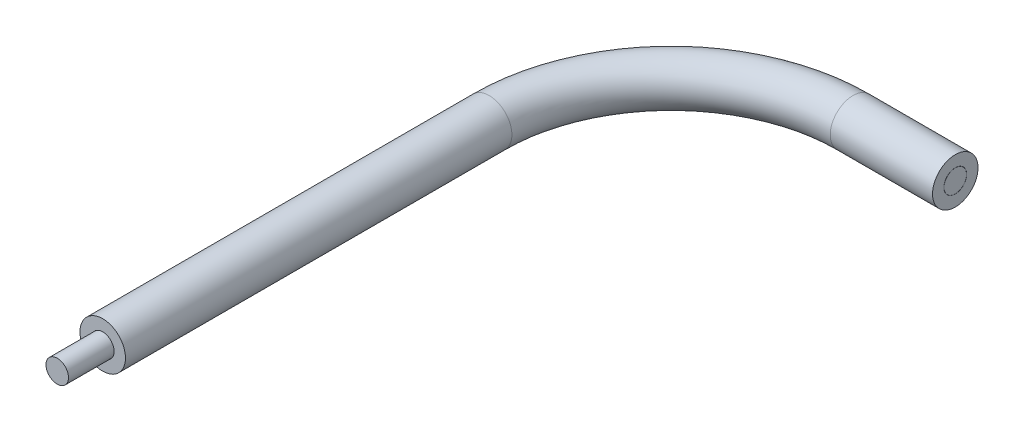
ISO-10303-21;
HEADER;
FILE_DESCRIPTION(('STEP AP214'),'2;1');
FILE_NAME('part.step','',(''),(''),'','','');
FILE_SCHEMA(('AUTOMOTIVE_DESIGN { 1 0 10303 214 1 1 1 1 }'));
ENDSEC;
DATA;
#1=APPLICATION_CONTEXT('core data for automotive mechanical design processes');
#2=APPLICATION_PROTOCOL_DEFINITION('international standard','automotive_design',2000,#1);
#3=PRODUCT_CONTEXT('',#1,'mechanical');
#4=PRODUCT('Part','Part','',(#3));
#5=PRODUCT_RELATED_PRODUCT_CATEGORY('part','',(#4));
#6=PRODUCT_DEFINITION_FORMATION('','',#4);
#7=PRODUCT_DEFINITION_CONTEXT('part definition',#1,'design');
#8=PRODUCT_DEFINITION('design','',#6,#7);
#9=PRODUCT_DEFINITION_SHAPE('','',#8);
#10=(LENGTH_UNIT() NAMED_UNIT(*) SI_UNIT(.MILLI.,.METRE.));
#11=(NAMED_UNIT(*) PLANE_ANGLE_UNIT() SI_UNIT($,.RADIAN.));
#12=(NAMED_UNIT(*) SI_UNIT($,.STERADIAN.) SOLID_ANGLE_UNIT());
#13=UNCERTAINTY_MEASURE_WITH_UNIT(LENGTH_MEASURE(1.E-05),#10,'distance_accuracy_value','');
#14=(GEOMETRIC_REPRESENTATION_CONTEXT(3) GLOBAL_UNCERTAINTY_ASSIGNED_CONTEXT((#13)) GLOBAL_UNIT_ASSIGNED_CONTEXT((#10,
#11,#12)) REPRESENTATION_CONTEXT('',''));
#15=CARTESIAN_POINT('',(0.,0.,0.));
#16=DIRECTION('',(0.,0.,1.));
#17=DIRECTION('',(1.,0.,0.));
#18=AXIS2_PLACEMENT_3D('',#15,#16,#17);
#19=CARTESIAN_POINT('',(12.5,0.,-25.));
#20=DIRECTION('',(-1.,0.,0.));
#21=DIRECTION('',(0.,0.,1.));
#22=AXIS2_PLACEMENT_3D('',#19,#20,#21);
#23=PLANE('',#22);
#24=CARTESIAN_POINT('',(12.5,0.,-25.));
#25=DIRECTION('',(-1.,0.,0.));
#26=DIRECTION('',(0.,0.,1.));
#27=AXIS2_PLACEMENT_3D('',#24,#25,#26);
#28=CIRCLE('',#27,0.495);
#29=CARTESIAN_POINT('',(12.5,0.,-24.505));
#30=VERTEX_POINT('',#29);
#31=EDGE_CURVE('E58',#30,#30,#28,.T.);
#32=ORIENTED_EDGE('',*,*,#31,.F.);
#33=EDGE_LOOP('',(#32));
#34=FACE_BOUND('',#33,.T.);
#35=ADVANCED_FACE('F44',(#34),#23,.F.);
#36=CARTESIAN_POINT('',(0.,0.,2.));
#37=DIRECTION('',(0.,0.,1.));
#38=DIRECTION('',(1.,0.,0.));
#39=AXIS2_PLACEMENT_3D('',#36,#37,#38);
#40=PLANE('',#39);
#41=CARTESIAN_POINT('',(0.,0.,2.));
#42=DIRECTION('',(0.,0.,1.));
#43=DIRECTION('',(1.,0.,0.));
#44=AXIS2_PLACEMENT_3D('',#41,#42,#43);
#45=CIRCLE('',#44,0.495);
#46=CARTESIAN_POINT('',(0.495,0.,2.));
#47=VERTEX_POINT('',#46);
#48=EDGE_CURVE('E11',#47,#47,#45,.T.);
#49=ORIENTED_EDGE('',*,*,#48,.T.);
#50=EDGE_LOOP('',(#49));
#51=FACE_BOUND('',#50,.T.);
#52=ADVANCED_FACE('F67',(#51),#40,.T.);
#53=CARTESIAN_POINT('',(12.5,0.,-25.));
#54=DIRECTION('',(-1.,0.,0.));
#55=DIRECTION('',(0.,0.,1.));
#56=AXIS2_PLACEMENT_3D('',#53,#54,#55);
#57=CYLINDRICAL_SURFACE('',#56,0.495);
#58=CARTESIAN_POINT('',(8.,0.,-25.));
#59=DIRECTION('',(-1.,0.,0.));
#60=DIRECTION('',(0.,0.,1.));
#61=AXIS2_PLACEMENT_3D('',#58,#59,#60);
#62=CIRCLE('',#61,0.495);
#63=CARTESIAN_POINT('',(8.,0.,-25.495));
#64=VERTEX_POINT('',#63);
#65=EDGE_CURVE('E54',#64,#64,#62,.T.);
#66=ORIENTED_EDGE('',*,*,#65,.F.);
#67=EDGE_LOOP('',(#66));
#68=FACE_BOUND('',#67,.T.);
#69=ORIENTED_EDGE('',*,*,#31,.T.);
#70=EDGE_LOOP('',(#69));
#71=FACE_BOUND('',#70,.T.);
#72=ADVANCED_FACE('F64',(#68,#71),#57,.T.);
#73=CARTESIAN_POINT('',(8.,0.,-17.));
#74=DIRECTION('',(0.,1.,0.));
#75=DIRECTION('',(0.,0.,1.));
#76=AXIS2_PLACEMENT_3D('',#73,#74,#75);
#77=TOROIDAL_SURFACE('',#76,8.,0.495);
#78=CARTESIAN_POINT('',(0.,0.,-17.));
#79=DIRECTION('',(0.,0.,1.));
#80=DIRECTION('',(1.,0.,0.));
#81=AXIS2_PLACEMENT_3D('',#78,#79,#80);
#82=CIRCLE('',#81,0.495);
#83=CARTESIAN_POINT('',(-0.495000000000001,0.,-17.));
#84=VERTEX_POINT('',#83);
#85=EDGE_CURVE('E50',#84,#84,#82,.T.);
#86=CARTESIAN_POINT('',(8.,0.,-17.));
#87=DIRECTION('',(0.,1.,0.));
#88=DIRECTION('',(0.,0.,1.));
#89=AXIS2_PLACEMENT_3D('',#86,#87,#88);
#90=CIRCLE('',#89,8.495);
#91=EDGE_CURVE('',#64,#84,#90,.T.);
#92=ORIENTED_EDGE('',*,*,#65,.T.);
#93=ORIENTED_EDGE('',*,*,#85,.F.);
#94=ORIENTED_EDGE('',*,*,#91,.T.);
#95=ORIENTED_EDGE('',*,*,#91,.F.);
#96=EDGE_LOOP('',(#92,#94,#93,#95));
#97=FACE_BOUND('',#96,.T.);
#98=ADVANCED_FACE('F73',(#97),#77,.T.);
#99=CARTESIAN_POINT('',(0.,0.,-17.));
#100=DIRECTION('',(0.,0.,1.));
#101=DIRECTION('',(1.,0.,0.));
#102=AXIS2_PLACEMENT_3D('',#99,#100,#101);
#103=CYLINDRICAL_SURFACE('',#102,0.495);
#104=ORIENTED_EDGE('',*,*,#48,.F.);
#105=EDGE_LOOP('',(#104));
#106=FACE_BOUND('',#105,.T.);
#107=ORIENTED_EDGE('',*,*,#85,.T.);
#108=EDGE_LOOP('',(#107));
#109=FACE_BOUND('',#108,.T.);
#110=ADVANCED_FACE('F71',(#106,#109),#103,.T.);
#111=CLOSED_SHELL('',(#35,#52,#72,#98,#110));
#112=MANIFOLD_SOLID_BREP('B2',#111);
#113=CARTESIAN_POINT('',(0.,0.,0.));
#114=DIRECTION('',(0.,0.,-1.));
#115=DIRECTION('',(-1.,0.,0.));
#116=AXIS2_PLACEMENT_3D('',#113,#114,#115);
#117=CYLINDRICAL_SURFACE('',#116,1.);
#118=CARTESIAN_POINT('',(0.,0.,-17.));
#119=DIRECTION('',(0.,0.,1.));
#120=DIRECTION('',(1.,0.,0.));
#121=AXIS2_PLACEMENT_3D('',#118,#119,#120);
#122=CIRCLE('',#121,1.);
#123=CARTESIAN_POINT('',(-1.,0.,-17.));
#124=VERTEX_POINT('',#123);
#125=EDGE_CURVE('E142',#124,#124,#122,.T.);
#126=ORIENTED_EDGE('',*,*,#125,.T.);
#127=EDGE_LOOP('',(#126));
#128=FACE_BOUND('',#127,.T.);
#129=CARTESIAN_POINT('',(0.,0.,0.));
#130=DIRECTION('',(0.,0.,1.));
#131=DIRECTION('',(1.,0.,0.));
#132=AXIS2_PLACEMENT_3D('',#129,#130,#131);
#133=CIRCLE('',#132,1.);
#134=CARTESIAN_POINT('',(1.,0.,0.));
#135=VERTEX_POINT('',#134);
#136=EDGE_CURVE('E139',#135,#135,#133,.T.);
#137=ORIENTED_EDGE('',*,*,#136,.F.);
#138=EDGE_LOOP('',(#137));
#139=FACE_BOUND('',#138,.T.);
#140=ADVANCED_FACE('F115',(#128,#139),#117,.T.);
#141=CARTESIAN_POINT('',(8.,0.,-17.));
#142=DIRECTION('',(0.,-1.,0.));
#143=DIRECTION('',(0.,0.,-1.));
#144=AXIS2_PLACEMENT_3D('',#141,#142,#143);
#145=TOROIDAL_SURFACE('',#144,8.,1.);
#146=CARTESIAN_POINT('',(8.,0.,-25.));
#147=DIRECTION('',(-1.,0.,0.));
#148=DIRECTION('',(0.,0.,1.));
#149=AXIS2_PLACEMENT_3D('',#146,#147,#148);
#150=CIRCLE('',#149,1.);
#151=CARTESIAN_POINT('',(8.,0.,-26.));
#152=VERTEX_POINT('',#151);
#153=EDGE_CURVE('E119',#152,#152,#150,.T.);
#154=CARTESIAN_POINT('',(8.,0.,-17.));
#155=DIRECTION('',(0.,-1.,0.));
#156=DIRECTION('',(0.,0.,-1.));
#157=AXIS2_PLACEMENT_3D('',#154,#155,#156);
#158=CIRCLE('',#157,9.);
#159=EDGE_CURVE('',#124,#152,#158,.T.);
#160=ORIENTED_EDGE('',*,*,#125,.F.);
#161=ORIENTED_EDGE('',*,*,#153,.T.);
#162=ORIENTED_EDGE('',*,*,#159,.T.);
#163=ORIENTED_EDGE('',*,*,#159,.F.);
#164=EDGE_LOOP('',(#160,#162,#161,#163));
#165=FACE_BOUND('',#164,.T.);
#166=ADVANCED_FACE('F151',(#165),#145,.T.);
#167=CARTESIAN_POINT('',(8.,0.,-25.));
#168=DIRECTION('',(1.,0.,0.));
#169=DIRECTION('',(0.,0.,-1.));
#170=AXIS2_PLACEMENT_3D('',#167,#168,#169);
#171=CYLINDRICAL_SURFACE('',#170,1.);
#172=CARTESIAN_POINT('',(12.5,0.,-25.));
#173=DIRECTION('',(-1.,0.,0.));
#174=DIRECTION('',(0.,0.,1.));
#175=AXIS2_PLACEMENT_3D('',#172,#173,#174);
#176=CIRCLE('',#175,1.);
#177=CARTESIAN_POINT('',(12.5,0.,-24.));
#178=VERTEX_POINT('',#177);
#179=EDGE_CURVE('E134',#178,#178,#176,.T.);
#180=ORIENTED_EDGE('',*,*,#179,.T.);
#181=EDGE_LOOP('',(#180));
#182=FACE_BOUND('',#181,.T.);
#183=ORIENTED_EDGE('',*,*,#153,.F.);
#184=EDGE_LOOP('',(#183));
#185=FACE_BOUND('',#184,.T.);
#186=ADVANCED_FACE('F117',(#182,#185),#171,.T.);
#187=CARTESIAN_POINT('',(0.,0.,0.));
#188=DIRECTION('',(0.,0.,1.));
#189=DIRECTION('',(1.,0.,0.));
#190=AXIS2_PLACEMENT_3D('',#187,#188,#189);
#191=PLANE('',#190);
#192=CARTESIAN_POINT('',(0.,0.,0.));
#193=DIRECTION('',(0.,0.,1.));
#194=DIRECTION('',(1.,0.,0.));
#195=AXIS2_PLACEMENT_3D('',#192,#193,#194);
#196=CIRCLE('',#195,0.5);
#197=CARTESIAN_POINT('',(0.5,0.,0.));
#198=VERTEX_POINT('',#197);
#199=EDGE_CURVE('E138',#198,#198,#196,.F.);
#200=ORIENTED_EDGE('',*,*,#199,.T.);
#201=EDGE_LOOP('',(#200));
#202=FACE_BOUND('',#201,.T.);
#203=ORIENTED_EDGE('',*,*,#136,.T.);
#204=EDGE_LOOP('',(#203));
#205=FACE_BOUND('',#204,.T.);
#206=ADVANCED_FACE('F155',(#202,#205),#191,.T.);
#207=CARTESIAN_POINT('',(12.5,0.,-25.));
#208=DIRECTION('',(-1.,0.,0.));
#209=DIRECTION('',(0.,0.,1.));
#210=AXIS2_PLACEMENT_3D('',#207,#208,#209);
#211=PLANE('',#210);
#212=CARTESIAN_POINT('',(12.5,0.,-25.));
#213=DIRECTION('',(-1.,0.,0.));
#214=DIRECTION('',(0.,0.,1.));
#215=AXIS2_PLACEMENT_3D('',#212,#213,#214);
#216=CIRCLE('',#215,0.5);
#217=CARTESIAN_POINT('',(12.5,0.,-24.5));
#218=VERTEX_POINT('',#217);
#219=EDGE_CURVE('E43',#218,#218,#216,.F.);
#220=ORIENTED_EDGE('',*,*,#219,.F.);
#221=EDGE_LOOP('',(#220));
#222=FACE_BOUND('',#221,.T.);
#223=ORIENTED_EDGE('',*,*,#179,.F.);
#224=EDGE_LOOP('',(#223));
#225=FACE_BOUND('',#224,.T.);
#226=ADVANCED_FACE('F161',(#222,#225),#211,.F.);
#227=CARTESIAN_POINT('',(0.,0.,0.));
#228=DIRECTION('',(0.,0.,-1.));
#229=DIRECTION('',(-1.,0.,0.));
#230=AXIS2_PLACEMENT_3D('',#227,#228,#229);
#231=CYLINDRICAL_SURFACE('',#230,0.5);
#232=CARTESIAN_POINT('',(0.,0.,-17.));
#233=DIRECTION('',(0.,0.,1.));
#234=DIRECTION('',(1.,0.,0.));
#235=AXIS2_PLACEMENT_3D('',#232,#233,#234);
#236=CIRCLE('',#235,0.5);
#237=CARTESIAN_POINT('',(-0.5,0.,-17.));
#238=VERTEX_POINT('',#237);
#239=EDGE_CURVE('E130',#238,#238,#236,.F.);
#240=ORIENTED_EDGE('',*,*,#239,.T.);
#241=EDGE_LOOP('',(#240));
#242=FACE_BOUND('',#241,.T.);
#243=ORIENTED_EDGE('',*,*,#199,.F.);
#244=EDGE_LOOP('',(#243));
#245=FACE_BOUND('',#244,.T.);
#246=ADVANCED_FACE('F171',(#242,#245),#231,.F.);
#247=CARTESIAN_POINT('',(8.,0.,-17.));
#248=DIRECTION('',(0.,-1.,0.));
#249=DIRECTION('',(0.,0.,-1.));
#250=AXIS2_PLACEMENT_3D('',#247,#248,#249);
#251=TOROIDAL_SURFACE('',#250,8.,0.5);
#252=CARTESIAN_POINT('',(8.,0.,-25.));
#253=DIRECTION('',(-1.,0.,0.));
#254=DIRECTION('',(0.,0.,1.));
#255=AXIS2_PLACEMENT_3D('',#252,#253,#254);
#256=CIRCLE('',#255,0.5);
#257=CARTESIAN_POINT('',(8.,0.,-25.5));
#258=VERTEX_POINT('',#257);
#259=EDGE_CURVE('E124',#258,#258,#256,.F.);
#260=CARTESIAN_POINT('',(8.,0.,-17.));
#261=DIRECTION('',(0.,-1.,0.));
#262=DIRECTION('',(0.,0.,-1.));
#263=AXIS2_PLACEMENT_3D('',#260,#261,#262);
#264=CIRCLE('',#263,8.5);
#265=EDGE_CURVE('',#238,#258,#264,.T.);
#266=ORIENTED_EDGE('',*,*,#239,.F.);
#267=ORIENTED_EDGE('',*,*,#259,.T.);
#268=ORIENTED_EDGE('',*,*,#265,.T.);
#269=ORIENTED_EDGE('',*,*,#265,.F.);
#270=EDGE_LOOP('',(#266,#268,#267,#269));
#271=FACE_BOUND('',#270,.T.);
#272=ADVANCED_FACE('F166',(#271),#251,.F.);
#273=CARTESIAN_POINT('',(8.,0.,-25.));
#274=DIRECTION('',(1.,0.,0.));
#275=DIRECTION('',(0.,0.,-1.));
#276=AXIS2_PLACEMENT_3D('',#273,#274,#275);
#277=CYLINDRICAL_SURFACE('',#276,0.5);
#278=ORIENTED_EDGE('',*,*,#219,.T.);
#279=EDGE_LOOP('',(#278));
#280=FACE_BOUND('',#279,.T.);
#281=ORIENTED_EDGE('',*,*,#259,.F.);
#282=EDGE_LOOP('',(#281));
#283=FACE_BOUND('',#282,.T.);
#284=ADVANCED_FACE('F164',(#280,#283),#277,.F.);
#285=CLOSED_SHELL('',(#140,#166,#186,#206,#226,#246,#272,#284));
#286=MANIFOLD_SOLID_BREP('B6',#285);
#287=ADVANCED_BREP_SHAPE_REPRESENTATION('',(#18,#112,#286),#14);
#288=SHAPE_DEFINITION_REPRESENTATION(#9,#287);
ENDSEC;
END-ISO-10303-21;
